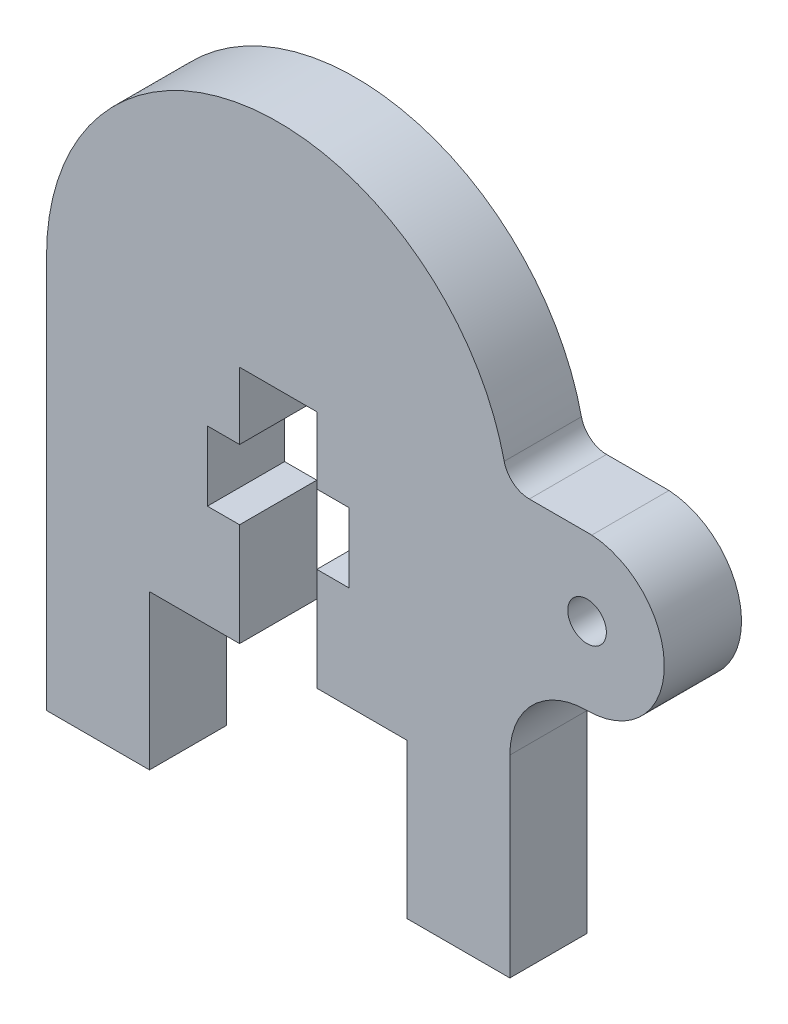
ISO-10303-21;
HEADER;
FILE_DESCRIPTION(('STEP AP214'),'2;1');
FILE_NAME('part.step','',(''),(''),'','','');
FILE_SCHEMA(('AUTOMOTIVE_DESIGN { 1 0 10303 214 1 1 1 1 }'));
ENDSEC;
DATA;
#1=APPLICATION_CONTEXT('core data for automotive mechanical design processes');
#2=APPLICATION_PROTOCOL_DEFINITION('international standard','automotive_design',2000,#1);
#3=PRODUCT_CONTEXT('',#1,'mechanical');
#4=PRODUCT('Part','Part','',(#3));
#5=PRODUCT_RELATED_PRODUCT_CATEGORY('part','',(#4));
#6=PRODUCT_DEFINITION_FORMATION('','',#4);
#7=PRODUCT_DEFINITION_CONTEXT('part definition',#1,'design');
#8=PRODUCT_DEFINITION('design','',#6,#7);
#9=PRODUCT_DEFINITION_SHAPE('','',#8);
#10=(LENGTH_UNIT() NAMED_UNIT(*) SI_UNIT(.MILLI.,.METRE.));
#11=(NAMED_UNIT(*) PLANE_ANGLE_UNIT() SI_UNIT($,.RADIAN.));
#12=(NAMED_UNIT(*) SI_UNIT($,.STERADIAN.) SOLID_ANGLE_UNIT());
#13=UNCERTAINTY_MEASURE_WITH_UNIT(LENGTH_MEASURE(1.E-05),#10,'distance_accuracy_value','');
#14=(GEOMETRIC_REPRESENTATION_CONTEXT(3) GLOBAL_UNCERTAINTY_ASSIGNED_CONTEXT((#13)) GLOBAL_UNIT_ASSIGNED_CONTEXT((#10,
#11,#12)) REPRESENTATION_CONTEXT('',''));
#15=CARTESIAN_POINT('',(0.,0.,0.));
#16=DIRECTION('',(0.,0.,1.));
#17=DIRECTION('',(1.,0.,0.));
#18=AXIS2_PLACEMENT_3D('',#15,#16,#17);
#19=CARTESIAN_POINT('',(9.,15.3,3.));
#20=DIRECTION('',(0.,0.,-1.));
#21=DIRECTION('',(-1.,0.,0.));
#22=AXIS2_PLACEMENT_3D('',#19,#20,#21);
#23=PLANE('',#22);
#24=DIRECTION('',(0.,-1.,0.));
#25=VECTOR('',#24,1.);
#26=CARTESIAN_POINT('',(0.,0.,3.));
#27=LINE('',#26,#25);
#28=CARTESIAN_POINT('',(0.,15.3,3.));
#29=VERTEX_POINT('',#28);
#30=CARTESIAN_POINT('',(0.,0.,3.));
#31=VERTEX_POINT('',#30);
#32=EDGE_CURVE('E279',#29,#31,#27,.T.);
#33=ORIENTED_EDGE('',*,*,#32,.T.);
#34=DIRECTION('',(1.,0.,0.));
#35=VECTOR('',#34,1.);
#36=CARTESIAN_POINT('',(0.,0.,3.));
#37=LINE('',#36,#35);
#38=CARTESIAN_POINT('',(4.,0.,3.));
#39=VERTEX_POINT('',#38);
#40=EDGE_CURVE('E147',#31,#39,#37,.T.);
#41=ORIENTED_EDGE('',*,*,#40,.T.);
#42=DIRECTION('',(0.,1.,0.));
#43=VECTOR('',#42,1.);
#44=CARTESIAN_POINT('',(4.,0.,3.));
#45=LINE('',#44,#43);
#46=CARTESIAN_POINT('',(4.,6.,3.));
#47=VERTEX_POINT('',#46);
#48=EDGE_CURVE('E342',#39,#47,#45,.T.);
#49=ORIENTED_EDGE('',*,*,#48,.T.);
#50=DIRECTION('',(1.,0.,0.));
#51=VECTOR('',#50,1.);
#52=CARTESIAN_POINT('',(4.,6.,3.));
#53=LINE('',#52,#51);
#54=CARTESIAN_POINT('',(7.5,6.,3.));
#55=VERTEX_POINT('',#54);
#56=EDGE_CURVE('E361',#47,#55,#53,.T.);
#57=ORIENTED_EDGE('',*,*,#56,.T.);
#58=DIRECTION('',(0.,1.,0.));
#59=VECTOR('',#58,1.);
#60=CARTESIAN_POINT('',(7.5,6.,3.));
#61=LINE('',#60,#59);
#62=CARTESIAN_POINT('',(7.5,10.,3.));
#63=VERTEX_POINT('',#62);
#64=EDGE_CURVE('E358',#55,#63,#61,.T.);
#65=ORIENTED_EDGE('',*,*,#64,.T.);
#66=DIRECTION('',(-1.,0.,0.));
#67=VECTOR('',#66,1.);
#68=CARTESIAN_POINT('',(7.5,10.,3.));
#69=LINE('',#68,#67);
#70=CARTESIAN_POINT('',(6.25,10.,3.));
#71=VERTEX_POINT('',#70);
#72=EDGE_CURVE('E360',#63,#71,#69,.T.);
#73=ORIENTED_EDGE('',*,*,#72,.T.);
#74=DIRECTION('',(0.,1.,0.));
#75=VECTOR('',#74,1.);
#76=CARTESIAN_POINT('',(6.25,10.,3.));
#77=LINE('',#76,#75);
#78=CARTESIAN_POINT('',(6.25,12.7,3.));
#79=VERTEX_POINT('',#78);
#80=EDGE_CURVE('E363',#71,#79,#77,.T.);
#81=ORIENTED_EDGE('',*,*,#80,.T.);
#82=DIRECTION('',(1.,0.,0.));
#83=VECTOR('',#82,1.);
#84=CARTESIAN_POINT('',(6.25,12.7,3.));
#85=LINE('',#84,#83);
#86=CARTESIAN_POINT('',(7.5,12.7,3.));
#87=VERTEX_POINT('',#86);
#88=EDGE_CURVE('E369',#79,#87,#85,.T.);
#89=ORIENTED_EDGE('',*,*,#88,.T.);
#90=DIRECTION('',(0.,1.,0.));
#91=VECTOR('',#90,1.);
#92=CARTESIAN_POINT('',(7.5,12.7,3.));
#93=LINE('',#92,#91);
#94=CARTESIAN_POINT('',(7.5,15.3,3.));
#95=VERTEX_POINT('',#94);
#96=EDGE_CURVE('E371',#87,#95,#93,.T.);
#97=ORIENTED_EDGE('',*,*,#96,.T.);
#98=DIRECTION('',(1.,0.,0.));
#99=VECTOR('',#98,1.);
#100=CARTESIAN_POINT('',(7.5,15.3,3.));
#101=LINE('',#100,#99);
#102=CARTESIAN_POINT('',(10.5,15.3,3.));
#103=VERTEX_POINT('',#102);
#104=EDGE_CURVE('E373',#95,#103,#101,.T.);
#105=ORIENTED_EDGE('',*,*,#104,.T.);
#106=DIRECTION('',(0.,-1.,0.));
#107=VECTOR('',#106,1.);
#108=CARTESIAN_POINT('',(10.5,15.3,3.));
#109=LINE('',#108,#107);
#110=CARTESIAN_POINT('',(10.5,12.7,3.));
#111=VERTEX_POINT('',#110);
#112=EDGE_CURVE('E375',#103,#111,#109,.T.);
#113=ORIENTED_EDGE('',*,*,#112,.T.);
#114=DIRECTION('',(1.,0.,0.));
#115=VECTOR('',#114,1.);
#116=CARTESIAN_POINT('',(10.5,12.7,3.));
#117=LINE('',#116,#115);
#118=CARTESIAN_POINT('',(11.75,12.7,3.));
#119=VERTEX_POINT('',#118);
#120=EDGE_CURVE('E377',#111,#119,#117,.T.);
#121=ORIENTED_EDGE('',*,*,#120,.T.);
#122=DIRECTION('',(0.,-1.,0.));
#123=VECTOR('',#122,1.);
#124=CARTESIAN_POINT('',(11.75,12.7,3.));
#125=LINE('',#124,#123);
#126=CARTESIAN_POINT('',(11.75,10.,3.));
#127=VERTEX_POINT('',#126);
#128=EDGE_CURVE('E379',#119,#127,#125,.T.);
#129=ORIENTED_EDGE('',*,*,#128,.T.);
#130=DIRECTION('',(-1.,0.,0.));
#131=VECTOR('',#130,1.);
#132=CARTESIAN_POINT('',(11.75,10.,3.));
#133=LINE('',#132,#131);
#134=CARTESIAN_POINT('',(10.5,10.,3.));
#135=VERTEX_POINT('',#134);
#136=EDGE_CURVE('E381',#127,#135,#133,.T.);
#137=ORIENTED_EDGE('',*,*,#136,.T.);
#138=DIRECTION('',(0.,-1.,0.));
#139=VECTOR('',#138,1.);
#140=CARTESIAN_POINT('',(10.5,10.,3.));
#141=LINE('',#140,#139);
#142=CARTESIAN_POINT('',(10.5,6.,3.));
#143=VERTEX_POINT('',#142);
#144=EDGE_CURVE('E383',#135,#143,#141,.T.);
#145=ORIENTED_EDGE('',*,*,#144,.T.);
#146=DIRECTION('',(1.,0.,0.));
#147=VECTOR('',#146,1.);
#148=CARTESIAN_POINT('',(10.5,6.,3.));
#149=LINE('',#148,#147);
#150=CARTESIAN_POINT('',(14.,6.,3.));
#151=VERTEX_POINT('',#150);
#152=EDGE_CURVE('E385',#143,#151,#149,.T.);
#153=ORIENTED_EDGE('',*,*,#152,.T.);
#154=DIRECTION('',(0.,-1.,0.));
#155=VECTOR('',#154,1.);
#156=CARTESIAN_POINT('',(14.,6.,3.));
#157=LINE('',#156,#155);
#158=CARTESIAN_POINT('',(14.,0.,3.));
#159=VERTEX_POINT('',#158);
#160=EDGE_CURVE('E387',#151,#159,#157,.T.);
#161=ORIENTED_EDGE('',*,*,#160,.T.);
#162=DIRECTION('',(1.,0.,0.));
#163=VECTOR('',#162,1.);
#164=CARTESIAN_POINT('',(14.,0.,3.));
#165=LINE('',#164,#163);
#166=CARTESIAN_POINT('',(18.,0.,3.));
#167=VERTEX_POINT('',#166);
#168=EDGE_CURVE('E389',#159,#167,#165,.T.);
#169=ORIENTED_EDGE('',*,*,#168,.T.);
#170=DIRECTION('',(0.,1.,0.));
#171=VECTOR('',#170,1.);
#172=CARTESIAN_POINT('',(18.,0.,3.));
#173=LINE('',#172,#171);
#174=CARTESIAN_POINT('',(18.,7.5,3.));
#175=VERTEX_POINT('',#174);
#176=EDGE_CURVE('E391',#167,#175,#173,.T.);
#177=ORIENTED_EDGE('',*,*,#176,.T.);
#178=CARTESIAN_POINT('',(21.,7.5,3.));
#179=DIRECTION('',(0.,0.,-1.));
#180=DIRECTION('',(-1.,0.,0.));
#181=AXIS2_PLACEMENT_3D('',#178,#179,#180);
#182=CIRCLE('',#181,3.);
#183=CARTESIAN_POINT('',(21.,10.5,3.));
#184=VERTEX_POINT('',#183);
#185=EDGE_CURVE('E393',#175,#184,#182,.T.);
#186=ORIENTED_EDGE('',*,*,#185,.T.);
#187=CARTESIAN_POINT('',(21.,13.5,3.));
#188=DIRECTION('',(0.,0.,1.));
#189=DIRECTION('',(1.,0.,0.));
#190=AXIS2_PLACEMENT_3D('',#187,#188,#189);
#191=CIRCLE('',#190,3.);
#192=CARTESIAN_POINT('',(21.1832723524264,16.494396641201,3.));
#193=VERTEX_POINT('',#192);
#194=EDGE_CURVE('E214',#184,#193,#191,.T.);
#195=ORIENTED_EDGE('',*,*,#194,.T.);
#196=DIRECTION('',(-1.,0.,0.));
#197=VECTOR('',#196,1.);
#198=CARTESIAN_POINT('',(21.1832723524264,16.494396641201,3.));
#199=LINE('',#198,#197);
#200=CARTESIAN_POINT('',(18.756260727404,16.494396641201,3.));
#201=VERTEX_POINT('',#200);
#202=EDGE_CURVE('E208',#193,#201,#199,.T.);
#203=ORIENTED_EDGE('',*,*,#202,.T.);
#204=CARTESIAN_POINT('',(18.756260727404,17.494396641201,3.));
#205=DIRECTION('',(0.,0.,-1.));
#206=DIRECTION('',(1.,0.,0.));
#207=AXIS2_PLACEMENT_3D('',#204,#205,#206);
#208=CIRCLE('',#207,0.999999999999999);
#209=CARTESIAN_POINT('',(17.7806346546636,17.2749569770809,3.));
#210=VERTEX_POINT('',#209);
#211=EDGE_CURVE('E212',#201,#210,#208,.T.);
#212=ORIENTED_EDGE('',*,*,#211,.T.);
#213=CARTESIAN_POINT('',(9.,15.3,3.));
#214=DIRECTION('',(0.,0.,1.));
#215=DIRECTION('',(-1.,0.,0.));
#216=AXIS2_PLACEMENT_3D('',#213,#214,#215);
#217=CIRCLE('',#216,9.);
#218=EDGE_CURVE('E56',#210,#29,#217,.T.);
#219=ORIENTED_EDGE('',*,*,#218,.T.);
#220=EDGE_LOOP('',(#33,#41,#49,#57,#65,#73,#81,#89,#97,#105,#113,#121,#129,#137,#145,#153,#161,
#169,#177,#186,#195,#203,#212,#219));
#221=FACE_BOUND('',#220,.T.);
#222=CARTESIAN_POINT('',(21.,13.5,3.));
#223=DIRECTION('',(0.,0.,1.));
#224=DIRECTION('',(1.,0.,0.));
#225=AXIS2_PLACEMENT_3D('',#222,#223,#224);
#226=CIRCLE('',#225,0.750000000000002);
#227=CARTESIAN_POINT('',(21.75,13.5,3.));
#228=VERTEX_POINT('',#227);
#229=EDGE_CURVE('E236',#228,#228,#226,.T.);
#230=ORIENTED_EDGE('',*,*,#229,.F.);
#231=EDGE_LOOP('',(#230));
#232=FACE_BOUND('',#231,.T.);
#233=ADVANCED_FACE('F39',(#221,#232),#23,.F.);
#234=CARTESIAN_POINT('',(9.,15.3,0.));
#235=DIRECTION('',(0.,0.,-1.));
#236=DIRECTION('',(-1.,0.,0.));
#237=AXIS2_PLACEMENT_3D('',#234,#235,#236);
#238=PLANE('',#237);
#239=DIRECTION('',(0.,-1.,0.));
#240=VECTOR('',#239,1.);
#241=CARTESIAN_POINT('',(0.,0.,0.));
#242=LINE('',#241,#240);
#243=CARTESIAN_POINT('',(0.,15.3,0.));
#244=VERTEX_POINT('',#243);
#245=CARTESIAN_POINT('',(0.,0.,0.));
#246=VERTEX_POINT('',#245);
#247=EDGE_CURVE('E232',#244,#246,#242,.T.);
#248=ORIENTED_EDGE('',*,*,#247,.F.);
#249=CARTESIAN_POINT('',(9.,15.3,0.));
#250=DIRECTION('',(0.,0.,1.));
#251=DIRECTION('',(-1.,0.,0.));
#252=AXIS2_PLACEMENT_3D('',#249,#250,#251);
#253=CIRCLE('',#252,9.);
#254=CARTESIAN_POINT('',(17.7806346546636,17.2749569770809,0.));
#255=VERTEX_POINT('',#254);
#256=EDGE_CURVE('E139',#255,#244,#253,.T.);
#257=ORIENTED_EDGE('',*,*,#256,.F.);
#258=CARTESIAN_POINT('',(18.756260727404,17.494396641201,0.));
#259=DIRECTION('',(0.,0.,-1.));
#260=DIRECTION('',(1.,0.,0.));
#261=AXIS2_PLACEMENT_3D('',#258,#259,#260);
#262=CIRCLE('',#261,0.999999999999999);
#263=CARTESIAN_POINT('',(18.756260727404,16.494396641201,0.));
#264=VERTEX_POINT('',#263);
#265=EDGE_CURVE('E133',#264,#255,#262,.T.);
#266=ORIENTED_EDGE('',*,*,#265,.F.);
#267=DIRECTION('',(-1.,0.,0.));
#268=VECTOR('',#267,1.);
#269=CARTESIAN_POINT('',(21.1832723524264,16.494396641201,0.));
#270=LINE('',#269,#268);
#271=CARTESIAN_POINT('',(21.1832723524264,16.494396641201,0.));
#272=VERTEX_POINT('',#271);
#273=EDGE_CURVE('E222',#272,#264,#270,.T.);
#274=ORIENTED_EDGE('',*,*,#273,.F.);
#275=CARTESIAN_POINT('',(21.,13.5,0.));
#276=DIRECTION('',(0.,0.,1.));
#277=DIRECTION('',(1.,0.,0.));
#278=AXIS2_PLACEMENT_3D('',#275,#276,#277);
#279=CIRCLE('',#278,3.);
#280=CARTESIAN_POINT('',(21.,10.5,0.));
#281=VERTEX_POINT('',#280);
#282=EDGE_CURVE('E274',#281,#272,#279,.T.);
#283=ORIENTED_EDGE('',*,*,#282,.F.);
#284=CARTESIAN_POINT('',(21.,7.5,0.));
#285=DIRECTION('',(0.,0.,-1.));
#286=DIRECTION('',(-1.,0.,0.));
#287=AXIS2_PLACEMENT_3D('',#284,#285,#286);
#288=CIRCLE('',#287,3.);
#289=CARTESIAN_POINT('',(18.,7.5,0.));
#290=VERTEX_POINT('',#289);
#291=EDGE_CURVE('E272',#290,#281,#288,.T.);
#292=ORIENTED_EDGE('',*,*,#291,.F.);
#293=DIRECTION('',(0.,1.,0.));
#294=VECTOR('',#293,1.);
#295=CARTESIAN_POINT('',(18.,0.,0.));
#296=LINE('',#295,#294);
#297=CARTESIAN_POINT('',(18.,0.,0.));
#298=VERTEX_POINT('',#297);
#299=EDGE_CURVE('E270',#298,#290,#296,.T.);
#300=ORIENTED_EDGE('',*,*,#299,.F.);
#301=DIRECTION('',(1.,0.,0.));
#302=VECTOR('',#301,1.);
#303=CARTESIAN_POINT('',(14.,0.,0.));
#304=LINE('',#303,#302);
#305=CARTESIAN_POINT('',(14.,0.,0.));
#306=VERTEX_POINT('',#305);
#307=EDGE_CURVE('E268',#306,#298,#304,.T.);
#308=ORIENTED_EDGE('',*,*,#307,.F.);
#309=DIRECTION('',(0.,-1.,0.));
#310=VECTOR('',#309,1.);
#311=CARTESIAN_POINT('',(14.,6.,0.));
#312=LINE('',#311,#310);
#313=CARTESIAN_POINT('',(14.,6.,0.));
#314=VERTEX_POINT('',#313);
#315=EDGE_CURVE('E266',#314,#306,#312,.T.);
#316=ORIENTED_EDGE('',*,*,#315,.F.);
#317=DIRECTION('',(1.,0.,0.));
#318=VECTOR('',#317,1.);
#319=CARTESIAN_POINT('',(10.5,6.,0.));
#320=LINE('',#319,#318);
#321=CARTESIAN_POINT('',(10.5,6.,0.));
#322=VERTEX_POINT('',#321);
#323=EDGE_CURVE('E264',#322,#314,#320,.T.);
#324=ORIENTED_EDGE('',*,*,#323,.F.);
#325=DIRECTION('',(0.,-1.,0.));
#326=VECTOR('',#325,1.);
#327=CARTESIAN_POINT('',(10.5,10.,0.));
#328=LINE('',#327,#326);
#329=CARTESIAN_POINT('',(10.5,10.,0.));
#330=VERTEX_POINT('',#329);
#331=EDGE_CURVE('E262',#330,#322,#328,.T.);
#332=ORIENTED_EDGE('',*,*,#331,.F.);
#333=DIRECTION('',(-1.,0.,0.));
#334=VECTOR('',#333,1.);
#335=CARTESIAN_POINT('',(11.75,10.,0.));
#336=LINE('',#335,#334);
#337=CARTESIAN_POINT('',(11.75,10.,0.));
#338=VERTEX_POINT('',#337);
#339=EDGE_CURVE('E260',#338,#330,#336,.T.);
#340=ORIENTED_EDGE('',*,*,#339,.F.);
#341=DIRECTION('',(0.,-1.,0.));
#342=VECTOR('',#341,1.);
#343=CARTESIAN_POINT('',(11.75,12.7,0.));
#344=LINE('',#343,#342);
#345=CARTESIAN_POINT('',(11.75,12.7,0.));
#346=VERTEX_POINT('',#345);
#347=EDGE_CURVE('E258',#346,#338,#344,.T.);
#348=ORIENTED_EDGE('',*,*,#347,.F.);
#349=DIRECTION('',(1.,0.,0.));
#350=VECTOR('',#349,1.);
#351=CARTESIAN_POINT('',(10.5,12.7,0.));
#352=LINE('',#351,#350);
#353=CARTESIAN_POINT('',(10.5,12.7,0.));
#354=VERTEX_POINT('',#353);
#355=EDGE_CURVE('E256',#354,#346,#352,.T.);
#356=ORIENTED_EDGE('',*,*,#355,.F.);
#357=DIRECTION('',(0.,-1.,0.));
#358=VECTOR('',#357,1.);
#359=CARTESIAN_POINT('',(10.5,15.3,0.));
#360=LINE('',#359,#358);
#361=CARTESIAN_POINT('',(10.5,15.3,0.));
#362=VERTEX_POINT('',#361);
#363=EDGE_CURVE('E254',#362,#354,#360,.T.);
#364=ORIENTED_EDGE('',*,*,#363,.F.);
#365=DIRECTION('',(1.,0.,0.));
#366=VECTOR('',#365,1.);
#367=CARTESIAN_POINT('',(7.5,15.3,0.));
#368=LINE('',#367,#366);
#369=CARTESIAN_POINT('',(7.5,15.3,0.));
#370=VERTEX_POINT('',#369);
#371=EDGE_CURVE('E252',#370,#362,#368,.T.);
#372=ORIENTED_EDGE('',*,*,#371,.F.);
#373=DIRECTION('',(0.,1.,0.));
#374=VECTOR('',#373,1.);
#375=CARTESIAN_POINT('',(7.5,12.7,0.));
#376=LINE('',#375,#374);
#377=CARTESIAN_POINT('',(7.5,12.7,0.));
#378=VERTEX_POINT('',#377);
#379=EDGE_CURVE('E250',#378,#370,#376,.T.);
#380=ORIENTED_EDGE('',*,*,#379,.F.);
#381=DIRECTION('',(1.,0.,0.));
#382=VECTOR('',#381,1.);
#383=CARTESIAN_POINT('',(6.25,12.7,0.));
#384=LINE('',#383,#382);
#385=CARTESIAN_POINT('',(6.25,12.7,0.));
#386=VERTEX_POINT('',#385);
#387=EDGE_CURVE('E248',#386,#378,#384,.T.);
#388=ORIENTED_EDGE('',*,*,#387,.F.);
#389=DIRECTION('',(0.,1.,0.));
#390=VECTOR('',#389,1.);
#391=CARTESIAN_POINT('',(6.25,10.,0.));
#392=LINE('',#391,#390);
#393=CARTESIAN_POINT('',(6.25,10.,0.));
#394=VERTEX_POINT('',#393);
#395=EDGE_CURVE('E246',#394,#386,#392,.T.);
#396=ORIENTED_EDGE('',*,*,#395,.F.);
#397=DIRECTION('',(-1.,0.,0.));
#398=VECTOR('',#397,1.);
#399=CARTESIAN_POINT('',(7.5,10.,0.));
#400=LINE('',#399,#398);
#401=CARTESIAN_POINT('',(7.5,10.,0.));
#402=VERTEX_POINT('',#401);
#403=EDGE_CURVE('E244',#402,#394,#400,.T.);
#404=ORIENTED_EDGE('',*,*,#403,.F.);
#405=DIRECTION('',(0.,1.,0.));
#406=VECTOR('',#405,1.);
#407=CARTESIAN_POINT('',(7.5,6.,0.));
#408=LINE('',#407,#406);
#409=CARTESIAN_POINT('',(7.5,6.,0.));
#410=VERTEX_POINT('',#409);
#411=EDGE_CURVE('E242',#410,#402,#408,.T.);
#412=ORIENTED_EDGE('',*,*,#411,.F.);
#413=DIRECTION('',(1.,0.,0.));
#414=VECTOR('',#413,1.);
#415=CARTESIAN_POINT('',(4.,6.,0.));
#416=LINE('',#415,#414);
#417=CARTESIAN_POINT('',(4.,6.,0.));
#418=VERTEX_POINT('',#417);
#419=EDGE_CURVE('E240',#418,#410,#416,.T.);
#420=ORIENTED_EDGE('',*,*,#419,.F.);
#421=DIRECTION('',(0.,1.,0.));
#422=VECTOR('',#421,1.);
#423=CARTESIAN_POINT('',(4.,0.,0.));
#424=LINE('',#423,#422);
#425=CARTESIAN_POINT('',(4.,0.,0.));
#426=VERTEX_POINT('',#425);
#427=EDGE_CURVE('E238',#426,#418,#424,.T.);
#428=ORIENTED_EDGE('',*,*,#427,.F.);
#429=DIRECTION('',(1.,0.,0.));
#430=VECTOR('',#429,1.);
#431=CARTESIAN_POINT('',(0.,0.,0.));
#432=LINE('',#431,#430);
#433=EDGE_CURVE('E235',#246,#426,#432,.T.);
#434=ORIENTED_EDGE('',*,*,#433,.F.);
#435=EDGE_LOOP('',(#248,#257,#266,#274,#283,#292,#300,#308,#316,#324,#332,#340,#348,#356,#364,
#372,#380,#388,#396,#404,#412,#420,#428,#434));
#436=FACE_BOUND('',#435,.T.);
#437=CARTESIAN_POINT('',(21.,13.5,0.));
#438=DIRECTION('',(0.,0.,1.));
#439=DIRECTION('',(1.,0.,0.));
#440=AXIS2_PLACEMENT_3D('',#437,#438,#439);
#441=CIRCLE('',#440,0.750000000000002);
#442=CARTESIAN_POINT('',(21.75,13.5,0.));
#443=VERTEX_POINT('',#442);
#444=EDGE_CURVE('E750',#443,#443,#441,.T.);
#445=ORIENTED_EDGE('',*,*,#444,.T.);
#446=EDGE_LOOP('',(#445));
#447=FACE_BOUND('',#446,.T.);
#448=ADVANCED_FACE('F346',(#436,#447),#238,.T.);
#449=CARTESIAN_POINT('',(0.,0.,3.));
#450=DIRECTION('',(1.,0.,0.));
#451=DIRECTION('',(0.,0.,-1.));
#452=AXIS2_PLACEMENT_3D('',#449,#450,#451);
#453=PLANE('',#452);
#454=ORIENTED_EDGE('',*,*,#247,.T.);
#455=DIRECTION('',(0.,0.,-1.));
#456=VECTOR('',#455,1.);
#457=CARTESIAN_POINT('',(0.,0.,3.));
#458=LINE('',#457,#456);
#459=EDGE_CURVE('E11',#31,#246,#458,.T.);
#460=ORIENTED_EDGE('',*,*,#459,.F.);
#461=ORIENTED_EDGE('',*,*,#32,.F.);
#462=DIRECTION('',(0.,0.,-1.));
#463=VECTOR('',#462,1.);
#464=CARTESIAN_POINT('',(0.,15.3,3.));
#465=LINE('',#464,#463);
#466=EDGE_CURVE('E228',#29,#244,#465,.T.);
#467=ORIENTED_EDGE('',*,*,#466,.T.);
#468=EDGE_LOOP('',(#454,#460,#461,#467));
#469=FACE_BOUND('',#468,.T.);
#470=ADVANCED_FACE('F41',(#469),#453,.F.);
#471=CARTESIAN_POINT('',(0.,0.,3.));
#472=DIRECTION('',(0.,1.,0.));
#473=DIRECTION('',(0.,0.,1.));
#474=AXIS2_PLACEMENT_3D('',#471,#472,#473);
#475=PLANE('',#474);
#476=ORIENTED_EDGE('',*,*,#433,.T.);
#477=DIRECTION('',(0.,0.,-1.));
#478=VECTOR('',#477,1.);
#479=CARTESIAN_POINT('',(4.,0.,3.));
#480=LINE('',#479,#478);
#481=EDGE_CURVE('E48',#39,#426,#480,.T.);
#482=ORIENTED_EDGE('',*,*,#481,.F.);
#483=ORIENTED_EDGE('',*,*,#40,.F.);
#484=ORIENTED_EDGE('',*,*,#459,.T.);
#485=EDGE_LOOP('',(#476,#482,#483,#484));
#486=FACE_BOUND('',#485,.T.);
#487=ADVANCED_FACE('F427',(#486),#475,.F.);
#488=CARTESIAN_POINT('',(4.,0.,3.));
#489=DIRECTION('',(-1.,0.,0.));
#490=DIRECTION('',(0.,0.,1.));
#491=AXIS2_PLACEMENT_3D('',#488,#489,#490);
#492=PLANE('',#491);
#493=ORIENTED_EDGE('',*,*,#427,.T.);
#494=DIRECTION('',(0.,0.,-1.));
#495=VECTOR('',#494,1.);
#496=CARTESIAN_POINT('',(4.,6.,3.));
#497=LINE('',#496,#495);
#498=EDGE_CURVE('E334',#47,#418,#497,.T.);
#499=ORIENTED_EDGE('',*,*,#498,.F.);
#500=ORIENTED_EDGE('',*,*,#48,.F.);
#501=ORIENTED_EDGE('',*,*,#481,.T.);
#502=EDGE_LOOP('',(#493,#499,#500,#501));
#503=FACE_BOUND('',#502,.T.);
#504=ADVANCED_FACE('F340',(#503),#492,.F.);
#505=CARTESIAN_POINT('',(4.,6.,3.));
#506=DIRECTION('',(0.,1.,0.));
#507=DIRECTION('',(0.,0.,1.));
#508=AXIS2_PLACEMENT_3D('',#505,#506,#507);
#509=PLANE('',#508);
#510=ORIENTED_EDGE('',*,*,#419,.T.);
#511=DIRECTION('',(0.,0.,-1.));
#512=VECTOR('',#511,1.);
#513=CARTESIAN_POINT('',(7.5,6.,3.));
#514=LINE('',#513,#512);
#515=EDGE_CURVE('E331',#55,#410,#514,.T.);
#516=ORIENTED_EDGE('',*,*,#515,.F.);
#517=ORIENTED_EDGE('',*,*,#56,.F.);
#518=ORIENTED_EDGE('',*,*,#498,.T.);
#519=EDGE_LOOP('',(#510,#516,#517,#518));
#520=FACE_BOUND('',#519,.T.);
#521=ADVANCED_FACE('F352',(#520),#509,.F.);
#522=CARTESIAN_POINT('',(7.5,6.,3.));
#523=DIRECTION('',(-1.,0.,0.));
#524=DIRECTION('',(0.,0.,1.));
#525=AXIS2_PLACEMENT_3D('',#522,#523,#524);
#526=PLANE('',#525);
#527=ORIENTED_EDGE('',*,*,#411,.T.);
#528=DIRECTION('',(0.,0.,-1.));
#529=VECTOR('',#528,1.);
#530=CARTESIAN_POINT('',(7.5,10.,3.));
#531=LINE('',#530,#529);
#532=EDGE_CURVE('E328',#63,#402,#531,.T.);
#533=ORIENTED_EDGE('',*,*,#532,.F.);
#534=ORIENTED_EDGE('',*,*,#64,.F.);
#535=ORIENTED_EDGE('',*,*,#515,.T.);
#536=EDGE_LOOP('',(#527,#533,#534,#535));
#537=FACE_BOUND('',#536,.T.);
#538=ADVANCED_FACE('F356',(#537),#526,.F.);
#539=CARTESIAN_POINT('',(7.5,10.,3.));
#540=DIRECTION('',(0.,-1.,0.));
#541=DIRECTION('',(0.,0.,-1.));
#542=AXIS2_PLACEMENT_3D('',#539,#540,#541);
#543=PLANE('',#542);
#544=ORIENTED_EDGE('',*,*,#403,.T.);
#545=DIRECTION('',(0.,0.,-1.));
#546=VECTOR('',#545,1.);
#547=CARTESIAN_POINT('',(6.25,10.,3.));
#548=LINE('',#547,#546);
#549=EDGE_CURVE('E325',#71,#394,#548,.T.);
#550=ORIENTED_EDGE('',*,*,#549,.F.);
#551=ORIENTED_EDGE('',*,*,#72,.F.);
#552=ORIENTED_EDGE('',*,*,#532,.T.);
#553=EDGE_LOOP('',(#544,#550,#551,#552));
#554=FACE_BOUND('',#553,.T.);
#555=ADVANCED_FACE('F440',(#554),#543,.F.);
#556=CARTESIAN_POINT('',(6.25,10.,3.));
#557=DIRECTION('',(-1.,0.,0.));
#558=DIRECTION('',(0.,0.,1.));
#559=AXIS2_PLACEMENT_3D('',#556,#557,#558);
#560=PLANE('',#559);
#561=ORIENTED_EDGE('',*,*,#395,.T.);
#562=DIRECTION('',(0.,0.,-1.));
#563=VECTOR('',#562,1.);
#564=CARTESIAN_POINT('',(6.25,12.7,3.));
#565=LINE('',#564,#563);
#566=EDGE_CURVE('E322',#79,#386,#565,.T.);
#567=ORIENTED_EDGE('',*,*,#566,.F.);
#568=ORIENTED_EDGE('',*,*,#80,.F.);
#569=ORIENTED_EDGE('',*,*,#549,.T.);
#570=EDGE_LOOP('',(#561,#567,#568,#569));
#571=FACE_BOUND('',#570,.T.);
#572=ADVANCED_FACE('F443',(#571),#560,.F.);
#573=CARTESIAN_POINT('',(6.25,12.7,3.));
#574=DIRECTION('',(0.,1.,0.));
#575=DIRECTION('',(0.,0.,1.));
#576=AXIS2_PLACEMENT_3D('',#573,#574,#575);
#577=PLANE('',#576);
#578=ORIENTED_EDGE('',*,*,#387,.T.);
#579=DIRECTION('',(0.,0.,-1.));
#580=VECTOR('',#579,1.);
#581=CARTESIAN_POINT('',(7.5,12.7,3.));
#582=LINE('',#581,#580);
#583=EDGE_CURVE('E319',#87,#378,#582,.T.);
#584=ORIENTED_EDGE('',*,*,#583,.F.);
#585=ORIENTED_EDGE('',*,*,#88,.F.);
#586=ORIENTED_EDGE('',*,*,#566,.T.);
#587=EDGE_LOOP('',(#578,#584,#585,#586));
#588=FACE_BOUND('',#587,.T.);
#589=ADVANCED_FACE('F447',(#588),#577,.F.);
#590=CARTESIAN_POINT('',(7.5,12.7,3.));
#591=DIRECTION('',(-1.,0.,0.));
#592=DIRECTION('',(0.,0.,1.));
#593=AXIS2_PLACEMENT_3D('',#590,#591,#592);
#594=PLANE('',#593);
#595=ORIENTED_EDGE('',*,*,#379,.T.);
#596=DIRECTION('',(0.,0.,-1.));
#597=VECTOR('',#596,1.);
#598=CARTESIAN_POINT('',(7.5,15.3,3.));
#599=LINE('',#598,#597);
#600=EDGE_CURVE('E316',#95,#370,#599,.T.);
#601=ORIENTED_EDGE('',*,*,#600,.F.);
#602=ORIENTED_EDGE('',*,*,#96,.F.);
#603=ORIENTED_EDGE('',*,*,#583,.T.);
#604=EDGE_LOOP('',(#595,#601,#602,#603));
#605=FACE_BOUND('',#604,.T.);
#606=ADVANCED_FACE('F451',(#605),#594,.F.);
#607=CARTESIAN_POINT('',(7.5,15.3,3.));
#608=DIRECTION('',(0.,1.,0.));
#609=DIRECTION('',(0.,0.,1.));
#610=AXIS2_PLACEMENT_3D('',#607,#608,#609);
#611=PLANE('',#610);
#612=ORIENTED_EDGE('',*,*,#371,.T.);
#613=DIRECTION('',(0.,0.,-1.));
#614=VECTOR('',#613,1.);
#615=CARTESIAN_POINT('',(10.5,15.3,3.));
#616=LINE('',#615,#614);
#617=EDGE_CURVE('E313',#103,#362,#616,.T.);
#618=ORIENTED_EDGE('',*,*,#617,.F.);
#619=ORIENTED_EDGE('',*,*,#104,.F.);
#620=ORIENTED_EDGE('',*,*,#600,.T.);
#621=EDGE_LOOP('',(#612,#618,#619,#620));
#622=FACE_BOUND('',#621,.T.);
#623=ADVANCED_FACE('F455',(#622),#611,.F.);
#624=CARTESIAN_POINT('',(10.5,15.3,3.));
#625=DIRECTION('',(1.,0.,0.));
#626=DIRECTION('',(0.,0.,-1.));
#627=AXIS2_PLACEMENT_3D('',#624,#625,#626);
#628=PLANE('',#627);
#629=ORIENTED_EDGE('',*,*,#363,.T.);
#630=DIRECTION('',(0.,0.,-1.));
#631=VECTOR('',#630,1.);
#632=CARTESIAN_POINT('',(10.5,12.7,3.));
#633=LINE('',#632,#631);
#634=EDGE_CURVE('E310',#111,#354,#633,.T.);
#635=ORIENTED_EDGE('',*,*,#634,.F.);
#636=ORIENTED_EDGE('',*,*,#112,.F.);
#637=ORIENTED_EDGE('',*,*,#617,.T.);
#638=EDGE_LOOP('',(#629,#635,#636,#637));
#639=FACE_BOUND('',#638,.T.);
#640=ADVANCED_FACE('F459',(#639),#628,.F.);
#641=CARTESIAN_POINT('',(10.5,12.7,3.));
#642=DIRECTION('',(0.,1.,0.));
#643=DIRECTION('',(0.,0.,1.));
#644=AXIS2_PLACEMENT_3D('',#641,#642,#643);
#645=PLANE('',#644);
#646=ORIENTED_EDGE('',*,*,#355,.T.);
#647=DIRECTION('',(0.,0.,-1.));
#648=VECTOR('',#647,1.);
#649=CARTESIAN_POINT('',(11.75,12.7,3.));
#650=LINE('',#649,#648);
#651=EDGE_CURVE('E307',#119,#346,#650,.T.);
#652=ORIENTED_EDGE('',*,*,#651,.F.);
#653=ORIENTED_EDGE('',*,*,#120,.F.);
#654=ORIENTED_EDGE('',*,*,#634,.T.);
#655=EDGE_LOOP('',(#646,#652,#653,#654));
#656=FACE_BOUND('',#655,.T.);
#657=ADVANCED_FACE('F463',(#656),#645,.F.);
#658=CARTESIAN_POINT('',(11.75,12.7,3.));
#659=DIRECTION('',(1.,0.,0.));
#660=DIRECTION('',(0.,0.,-1.));
#661=AXIS2_PLACEMENT_3D('',#658,#659,#660);
#662=PLANE('',#661);
#663=ORIENTED_EDGE('',*,*,#347,.T.);
#664=DIRECTION('',(0.,0.,-1.));
#665=VECTOR('',#664,1.);
#666=CARTESIAN_POINT('',(11.75,10.,3.));
#667=LINE('',#666,#665);
#668=EDGE_CURVE('E304',#127,#338,#667,.T.);
#669=ORIENTED_EDGE('',*,*,#668,.F.);
#670=ORIENTED_EDGE('',*,*,#128,.F.);
#671=ORIENTED_EDGE('',*,*,#651,.T.);
#672=EDGE_LOOP('',(#663,#669,#670,#671));
#673=FACE_BOUND('',#672,.T.);
#674=ADVANCED_FACE('F467',(#673),#662,.F.);
#675=CARTESIAN_POINT('',(11.75,10.,3.));
#676=DIRECTION('',(0.,-1.,0.));
#677=DIRECTION('',(0.,0.,-1.));
#678=AXIS2_PLACEMENT_3D('',#675,#676,#677);
#679=PLANE('',#678);
#680=ORIENTED_EDGE('',*,*,#339,.T.);
#681=DIRECTION('',(0.,0.,-1.));
#682=VECTOR('',#681,1.);
#683=CARTESIAN_POINT('',(10.5,10.,3.));
#684=LINE('',#683,#682);
#685=EDGE_CURVE('E301',#135,#330,#684,.T.);
#686=ORIENTED_EDGE('',*,*,#685,.F.);
#687=ORIENTED_EDGE('',*,*,#136,.F.);
#688=ORIENTED_EDGE('',*,*,#668,.T.);
#689=EDGE_LOOP('',(#680,#686,#687,#688));
#690=FACE_BOUND('',#689,.T.);
#691=ADVANCED_FACE('F471',(#690),#679,.F.);
#692=CARTESIAN_POINT('',(10.5,10.,3.));
#693=DIRECTION('',(1.,0.,0.));
#694=DIRECTION('',(0.,0.,-1.));
#695=AXIS2_PLACEMENT_3D('',#692,#693,#694);
#696=PLANE('',#695);
#697=ORIENTED_EDGE('',*,*,#331,.T.);
#698=DIRECTION('',(0.,0.,-1.));
#699=VECTOR('',#698,1.);
#700=CARTESIAN_POINT('',(10.5,6.,3.));
#701=LINE('',#700,#699);
#702=EDGE_CURVE('E298',#143,#322,#701,.T.);
#703=ORIENTED_EDGE('',*,*,#702,.F.);
#704=ORIENTED_EDGE('',*,*,#144,.F.);
#705=ORIENTED_EDGE('',*,*,#685,.T.);
#706=EDGE_LOOP('',(#697,#703,#704,#705));
#707=FACE_BOUND('',#706,.T.);
#708=ADVANCED_FACE('F475',(#707),#696,.F.);
#709=CARTESIAN_POINT('',(10.5,6.,3.));
#710=DIRECTION('',(0.,1.,0.));
#711=DIRECTION('',(0.,0.,1.));
#712=AXIS2_PLACEMENT_3D('',#709,#710,#711);
#713=PLANE('',#712);
#714=ORIENTED_EDGE('',*,*,#323,.T.);
#715=DIRECTION('',(0.,0.,-1.));
#716=VECTOR('',#715,1.);
#717=CARTESIAN_POINT('',(14.,6.,3.));
#718=LINE('',#717,#716);
#719=EDGE_CURVE('E295',#151,#314,#718,.T.);
#720=ORIENTED_EDGE('',*,*,#719,.F.);
#721=ORIENTED_EDGE('',*,*,#152,.F.);
#722=ORIENTED_EDGE('',*,*,#702,.T.);
#723=EDGE_LOOP('',(#714,#720,#721,#722));
#724=FACE_BOUND('',#723,.T.);
#725=ADVANCED_FACE('F479',(#724),#713,.F.);
#726=CARTESIAN_POINT('',(14.,6.,3.));
#727=DIRECTION('',(1.,0.,0.));
#728=DIRECTION('',(0.,0.,-1.));
#729=AXIS2_PLACEMENT_3D('',#726,#727,#728);
#730=PLANE('',#729);
#731=ORIENTED_EDGE('',*,*,#315,.T.);
#732=DIRECTION('',(0.,0.,-1.));
#733=VECTOR('',#732,1.);
#734=CARTESIAN_POINT('',(14.,0.,3.));
#735=LINE('',#734,#733);
#736=EDGE_CURVE('E292',#159,#306,#735,.T.);
#737=ORIENTED_EDGE('',*,*,#736,.F.);
#738=ORIENTED_EDGE('',*,*,#160,.F.);
#739=ORIENTED_EDGE('',*,*,#719,.T.);
#740=EDGE_LOOP('',(#731,#737,#738,#739));
#741=FACE_BOUND('',#740,.T.);
#742=ADVANCED_FACE('F483',(#741),#730,.F.);
#743=CARTESIAN_POINT('',(14.,0.,3.));
#744=DIRECTION('',(0.,1.,0.));
#745=DIRECTION('',(0.,0.,1.));
#746=AXIS2_PLACEMENT_3D('',#743,#744,#745);
#747=PLANE('',#746);
#748=ORIENTED_EDGE('',*,*,#307,.T.);
#749=DIRECTION('',(0.,0.,-1.));
#750=VECTOR('',#749,1.);
#751=CARTESIAN_POINT('',(18.,0.,3.));
#752=LINE('',#751,#750);
#753=EDGE_CURVE('E289',#167,#298,#752,.T.);
#754=ORIENTED_EDGE('',*,*,#753,.F.);
#755=ORIENTED_EDGE('',*,*,#168,.F.);
#756=ORIENTED_EDGE('',*,*,#736,.T.);
#757=EDGE_LOOP('',(#748,#754,#755,#756));
#758=FACE_BOUND('',#757,.T.);
#759=ADVANCED_FACE('F487',(#758),#747,.F.);
#760=CARTESIAN_POINT('',(18.,0.,3.));
#761=DIRECTION('',(-1.,0.,0.));
#762=DIRECTION('',(0.,0.,1.));
#763=AXIS2_PLACEMENT_3D('',#760,#761,#762);
#764=PLANE('',#763);
#765=ORIENTED_EDGE('',*,*,#299,.T.);
#766=DIRECTION('',(0.,0.,-1.));
#767=VECTOR('',#766,1.);
#768=CARTESIAN_POINT('',(18.,7.5,3.));
#769=LINE('',#768,#767);
#770=EDGE_CURVE('E286',#175,#290,#769,.T.);
#771=ORIENTED_EDGE('',*,*,#770,.F.);
#772=ORIENTED_EDGE('',*,*,#176,.F.);
#773=ORIENTED_EDGE('',*,*,#753,.T.);
#774=EDGE_LOOP('',(#765,#771,#772,#773));
#775=FACE_BOUND('',#774,.T.);
#776=ADVANCED_FACE('F491',(#775),#764,.F.);
#777=CARTESIAN_POINT('',(21.,7.5,3.));
#778=DIRECTION('',(0.,0.,-1.));
#779=DIRECTION('',(-1.,0.,0.));
#780=AXIS2_PLACEMENT_3D('',#777,#778,#779);
#781=CYLINDRICAL_SURFACE('',#780,3.);
#782=ORIENTED_EDGE('',*,*,#291,.T.);
#783=DIRECTION('',(0.,0.,-1.));
#784=VECTOR('',#783,1.);
#785=CARTESIAN_POINT('',(21.,10.5,3.));
#786=LINE('',#785,#784);
#787=EDGE_CURVE('E283',#184,#281,#786,.T.);
#788=ORIENTED_EDGE('',*,*,#787,.F.);
#789=ORIENTED_EDGE('',*,*,#185,.F.);
#790=ORIENTED_EDGE('',*,*,#770,.T.);
#791=EDGE_LOOP('',(#782,#788,#789,#790));
#792=FACE_BOUND('',#791,.T.);
#793=ADVANCED_FACE('F399',(#792),#781,.F.);
#794=CARTESIAN_POINT('',(21.,13.5,3.));
#795=DIRECTION('',(0.,0.,-1.));
#796=DIRECTION('',(-1.,0.,0.));
#797=AXIS2_PLACEMENT_3D('',#794,#795,#796);
#798=CYLINDRICAL_SURFACE('',#797,3.);
#799=ORIENTED_EDGE('',*,*,#282,.T.);
#800=DIRECTION('',(0.,0.,-1.));
#801=VECTOR('',#800,1.);
#802=CARTESIAN_POINT('',(21.1832723524264,16.494396641201,3.));
#803=LINE('',#802,#801);
#804=EDGE_CURVE('E223',#193,#272,#803,.T.);
#805=ORIENTED_EDGE('',*,*,#804,.F.);
#806=ORIENTED_EDGE('',*,*,#194,.F.);
#807=ORIENTED_EDGE('',*,*,#787,.T.);
#808=EDGE_LOOP('',(#799,#805,#806,#807));
#809=FACE_BOUND('',#808,.T.);
#810=ADVANCED_FACE('F403',(#809),#798,.T.);
#811=CARTESIAN_POINT('',(21.1832723524264,16.494396641201,3.));
#812=DIRECTION('',(0.,-1.,0.));
#813=DIRECTION('',(0.,0.,-1.));
#814=AXIS2_PLACEMENT_3D('',#811,#812,#813);
#815=PLANE('',#814);
#816=ORIENTED_EDGE('',*,*,#273,.T.);
#817=DIRECTION('',(0.,0.,-1.));
#818=VECTOR('',#817,1.);
#819=CARTESIAN_POINT('',(18.756260727404,16.494396641201,3.));
#820=LINE('',#819,#818);
#821=EDGE_CURVE('E219',#201,#264,#820,.T.);
#822=ORIENTED_EDGE('',*,*,#821,.F.);
#823=ORIENTED_EDGE('',*,*,#202,.F.);
#824=ORIENTED_EDGE('',*,*,#804,.T.);
#825=EDGE_LOOP('',(#816,#822,#823,#824));
#826=FACE_BOUND('',#825,.T.);
#827=ADVANCED_FACE('F220',(#826),#815,.F.);
#828=CARTESIAN_POINT('',(18.756260727404,17.494396641201,3.));
#829=DIRECTION('',(0.,0.,-1.));
#830=DIRECTION('',(-1.,0.,0.));
#831=AXIS2_PLACEMENT_3D('',#828,#829,#830);
#832=CYLINDRICAL_SURFACE('',#831,0.999999999999999);
#833=ORIENTED_EDGE('',*,*,#265,.T.);
#834=DIRECTION('',(0.,0.,-1.));
#835=VECTOR('',#834,1.);
#836=CARTESIAN_POINT('',(17.7806346546636,17.2749569770809,3.));
#837=LINE('',#836,#835);
#838=EDGE_CURVE('E224',#210,#255,#837,.T.);
#839=ORIENTED_EDGE('',*,*,#838,.F.);
#840=ORIENTED_EDGE('',*,*,#211,.F.);
#841=ORIENTED_EDGE('',*,*,#821,.T.);
#842=EDGE_LOOP('',(#833,#839,#840,#841));
#843=FACE_BOUND('',#842,.T.);
#844=ADVANCED_FACE('F226',(#843),#832,.F.);
#845=CARTESIAN_POINT('',(9.,15.3,3.));
#846=DIRECTION('',(0.,0.,-1.));
#847=DIRECTION('',(-1.,0.,0.));
#848=AXIS2_PLACEMENT_3D('',#845,#846,#847);
#849=CYLINDRICAL_SURFACE('',#848,9.);
#850=ORIENTED_EDGE('',*,*,#256,.T.);
#851=ORIENTED_EDGE('',*,*,#466,.F.);
#852=ORIENTED_EDGE('',*,*,#218,.F.);
#853=ORIENTED_EDGE('',*,*,#838,.T.);
#854=EDGE_LOOP('',(#850,#851,#852,#853));
#855=FACE_BOUND('',#854,.T.);
#856=ADVANCED_FACE('F407',(#855),#849,.T.);
#857=CARTESIAN_POINT('',(21.,13.5,3.));
#858=DIRECTION('',(0.,0.,-1.));
#859=DIRECTION('',(-1.,0.,0.));
#860=AXIS2_PLACEMENT_3D('',#857,#858,#859);
#861=CYLINDRICAL_SURFACE('',#860,0.750000000000002);
#862=ORIENTED_EDGE('',*,*,#229,.T.);
#863=EDGE_LOOP('',(#862));
#864=FACE_BOUND('',#863,.T.);
#865=ORIENTED_EDGE('',*,*,#444,.F.);
#866=EDGE_LOOP('',(#865));
#867=FACE_BOUND('',#866,.T.);
#868=ADVANCED_FACE('F409',(#864,#867),#861,.F.);
#869=CLOSED_SHELL('',(#233,#448,#470,#487,#504,#521,#538,#555,#572,#589,#606,#623,#640,#657,
#674,#691,#708,#725,#742,#759,#776,#793,#810,#827,#844,#856,#868));
#870=MANIFOLD_SOLID_BREP('B2',#869);
#871=ADVANCED_BREP_SHAPE_REPRESENTATION('',(#18,#870),#14);
#872=SHAPE_DEFINITION_REPRESENTATION(#9,#871);
ENDSEC;
END-ISO-10303-21;
